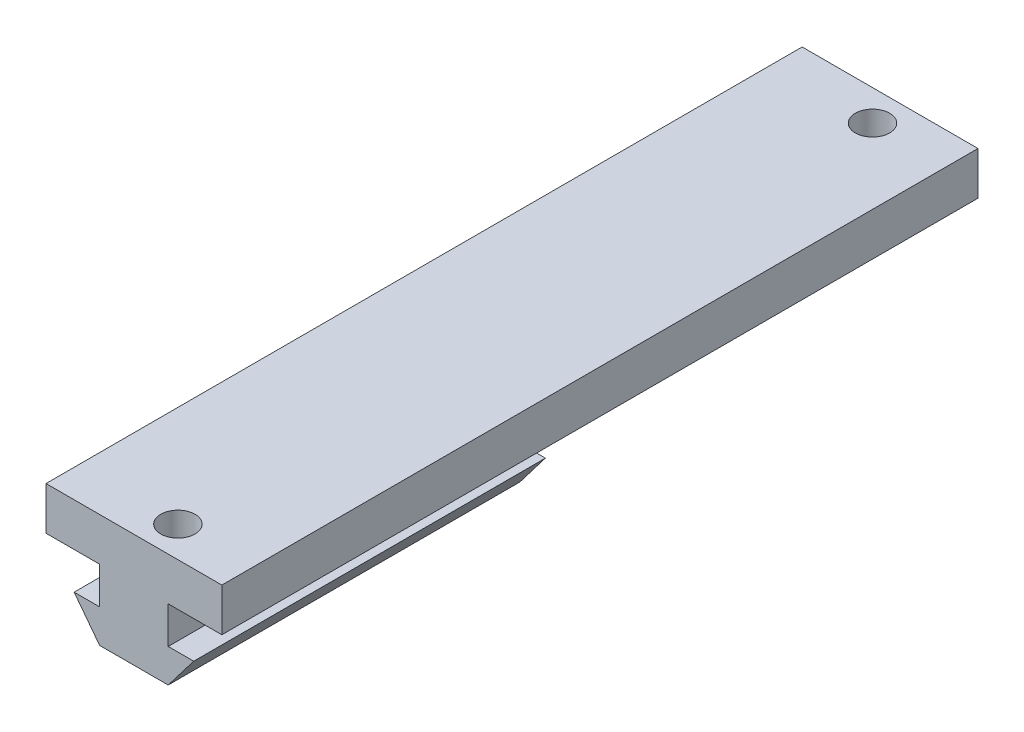
ISO-10303-21;
HEADER;
FILE_DESCRIPTION(('STEP AP214'),'2;1');
FILE_NAME('part.step','',(''),(''),'','','');
FILE_SCHEMA(('AUTOMOTIVE_DESIGN { 1 0 10303 214 1 1 1 1 }'));
ENDSEC;
DATA;
#1=APPLICATION_CONTEXT('core data for automotive mechanical design processes');
#2=APPLICATION_PROTOCOL_DEFINITION('international standard','automotive_design',2000,#1);
#3=PRODUCT_CONTEXT('',#1,'mechanical');
#4=PRODUCT('Part','Part','',(#3));
#5=PRODUCT_RELATED_PRODUCT_CATEGORY('part','',(#4));
#6=PRODUCT_DEFINITION_FORMATION('','',#4);
#7=PRODUCT_DEFINITION_CONTEXT('part definition',#1,'design');
#8=PRODUCT_DEFINITION('design','',#6,#7);
#9=PRODUCT_DEFINITION_SHAPE('','',#8);
#10=(LENGTH_UNIT() NAMED_UNIT(*) SI_UNIT(.MILLI.,.METRE.));
#11=(NAMED_UNIT(*) PLANE_ANGLE_UNIT() SI_UNIT($,.RADIAN.));
#12=(NAMED_UNIT(*) SI_UNIT($,.STERADIAN.) SOLID_ANGLE_UNIT());
#13=UNCERTAINTY_MEASURE_WITH_UNIT(LENGTH_MEASURE(1.E-05),#10,'distance_accuracy_value','');
#14=(GEOMETRIC_REPRESENTATION_CONTEXT(3) GLOBAL_UNCERTAINTY_ASSIGNED_CONTEXT((#13)) GLOBAL_UNIT_ASSIGNED_CONTEXT((#10,
#11,#12)) REPRESENTATION_CONTEXT('',''));
#15=CARTESIAN_POINT('',(0.,0.,0.));
#16=DIRECTION('',(0.,0.,1.));
#17=DIRECTION('',(1.,0.,0.));
#18=AXIS2_PLACEMENT_3D('',#15,#16,#17);
#19=CARTESIAN_POINT('',(10.,4.9,43.));
#20=DIRECTION('',(-1.,0.,0.));
#21=DIRECTION('',(0.,0.,1.));
#22=AXIS2_PLACEMENT_3D('',#19,#20,#21);
#23=PLANE('',#22);
#24=DIRECTION('',(0.,0.,-1.));
#25=VECTOR('',#24,1.);
#26=CARTESIAN_POINT('',(10.,0.,43.));
#27=LINE('',#26,#25);
#28=CARTESIAN_POINT('',(10.,0.,43.));
#29=VERTEX_POINT('',#28);
#30=CARTESIAN_POINT('',(10.,0.,-43.));
#31=VERTEX_POINT('',#30);
#32=EDGE_CURVE('E221',#29,#31,#27,.T.);
#33=ORIENTED_EDGE('',*,*,#32,.T.);
#34=DIRECTION('',(0.,-1.,0.));
#35=VECTOR('',#34,1.);
#36=CARTESIAN_POINT('',(10.,4.9,-43.));
#37=LINE('',#36,#35);
#38=CARTESIAN_POINT('',(10.,4.9,-43.));
#39=VERTEX_POINT('',#38);
#40=EDGE_CURVE('E11',#39,#31,#37,.T.);
#41=ORIENTED_EDGE('',*,*,#40,.F.);
#42=DIRECTION('',(0.,0.,-1.));
#43=VECTOR('',#42,1.);
#44=CARTESIAN_POINT('',(10.,4.9,43.));
#45=LINE('',#44,#43);
#46=CARTESIAN_POINT('',(10.,4.9,43.));
#47=VERTEX_POINT('',#46);
#48=EDGE_CURVE('E239',#47,#39,#45,.T.);
#49=ORIENTED_EDGE('',*,*,#48,.F.);
#50=DIRECTION('',(0.,-1.,0.));
#51=VECTOR('',#50,1.);
#52=CARTESIAN_POINT('',(10.,4.9,43.));
#53=LINE('',#52,#51);
#54=EDGE_CURVE('E250',#47,#29,#53,.T.);
#55=ORIENTED_EDGE('',*,*,#54,.T.);
#56=EDGE_LOOP('',(#33,#41,#49,#55));
#57=FACE_BOUND('',#56,.T.);
#58=ADVANCED_FACE('F45',(#57),#23,.F.);
#59=CARTESIAN_POINT('',(-10.,4.9,-43.));
#60=DIRECTION('',(0.,0.,1.));
#61=DIRECTION('',(1.,0.,0.));
#62=AXIS2_PLACEMENT_3D('',#59,#60,#61);
#63=PLANE('',#62);
#64=DIRECTION('',(-1.,0.,0.));
#65=VECTOR('',#64,1.);
#66=CARTESIAN_POINT('',(-10.,0.,-43.));
#67=LINE('',#66,#65);
#68=CARTESIAN_POINT('',(-10.,0.,-43.));
#69=VERTEX_POINT('',#68);
#70=EDGE_CURVE('E254',#31,#69,#67,.T.);
#71=ORIENTED_EDGE('',*,*,#70,.T.);
#72=DIRECTION('',(0.,-1.,0.));
#73=VECTOR('',#72,1.);
#74=CARTESIAN_POINT('',(-10.,4.9,-43.));
#75=LINE('',#74,#73);
#76=CARTESIAN_POINT('',(-10.,4.9,-43.));
#77=VERTEX_POINT('',#76);
#78=EDGE_CURVE('E54',#77,#69,#75,.T.);
#79=ORIENTED_EDGE('',*,*,#78,.F.);
#80=DIRECTION('',(-1.,0.,0.));
#81=VECTOR('',#80,1.);
#82=CARTESIAN_POINT('',(-10.,4.9,-43.));
#83=LINE('',#82,#81);
#84=EDGE_CURVE('E98',#39,#77,#83,.T.);
#85=ORIENTED_EDGE('',*,*,#84,.F.);
#86=ORIENTED_EDGE('',*,*,#40,.T.);
#87=EDGE_LOOP('',(#71,#79,#85,#86));
#88=FACE_BOUND('',#87,.T.);
#89=ADVANCED_FACE('F296',(#88),#63,.F.);
#90=CARTESIAN_POINT('',(-10.,4.9,43.));
#91=DIRECTION('',(1.,0.,0.));
#92=DIRECTION('',(0.,0.,-1.));
#93=AXIS2_PLACEMENT_3D('',#90,#91,#92);
#94=PLANE('',#93);
#95=DIRECTION('',(0.,0.,1.));
#96=VECTOR('',#95,1.);
#97=CARTESIAN_POINT('',(-10.,0.,43.));
#98=LINE('',#97,#96);
#99=CARTESIAN_POINT('',(-10.,0.,43.));
#100=VERTEX_POINT('',#99);
#101=EDGE_CURVE('E257',#69,#100,#98,.T.);
#102=ORIENTED_EDGE('',*,*,#101,.T.);
#103=DIRECTION('',(0.,-1.,0.));
#104=VECTOR('',#103,1.);
#105=CARTESIAN_POINT('',(-10.,4.9,43.));
#106=LINE('',#105,#104);
#107=CARTESIAN_POINT('',(-10.,4.9,43.));
#108=VERTEX_POINT('',#107);
#109=EDGE_CURVE('E264',#108,#100,#106,.T.);
#110=ORIENTED_EDGE('',*,*,#109,.F.);
#111=DIRECTION('',(0.,0.,1.));
#112=VECTOR('',#111,1.);
#113=CARTESIAN_POINT('',(-10.,4.9,43.));
#114=LINE('',#113,#112);
#115=EDGE_CURVE('E245',#77,#108,#114,.T.);
#116=ORIENTED_EDGE('',*,*,#115,.F.);
#117=ORIENTED_EDGE('',*,*,#78,.T.);
#118=EDGE_LOOP('',(#102,#110,#116,#117));
#119=FACE_BOUND('',#118,.T.);
#120=ADVANCED_FACE('F273',(#119),#94,.F.);
#121=CARTESIAN_POINT('',(-10.,4.9,43.));
#122=DIRECTION('',(0.,0.,-1.));
#123=DIRECTION('',(-1.,0.,0.));
#124=AXIS2_PLACEMENT_3D('',#121,#122,#123);
#125=PLANE('',#124);
#126=DIRECTION('',(1.,0.,0.));
#127=VECTOR('',#126,1.);
#128=CARTESIAN_POINT('',(-10.,0.,43.));
#129=LINE('',#128,#127);
#130=CARTESIAN_POINT('',(-3.90000000000001,0.,43.));
#131=VERTEX_POINT('',#130);
#132=EDGE_CURVE('E242',#100,#131,#129,.T.);
#133=ORIENTED_EDGE('',*,*,#132,.T.);
#134=DIRECTION('',(0.,-1.,0.));
#135=VECTOR('',#134,1.);
#136=CARTESIAN_POINT('',(-3.90000000000001,0.,43.));
#137=LINE('',#136,#135);
#138=CARTESIAN_POINT('',(-3.90000000000001,-4.2,43.));
#139=VERTEX_POINT('',#138);
#140=EDGE_CURVE('E61',#131,#139,#137,.T.);
#141=ORIENTED_EDGE('',*,*,#140,.T.);
#142=DIRECTION('',(-1.,0.,0.));
#143=VECTOR('',#142,1.);
#144=CARTESIAN_POINT('',(-3.90000000000001,-4.2,43.));
#145=LINE('',#144,#143);
#146=CARTESIAN_POINT('',(-6.80000000000001,-4.2,43.));
#147=VERTEX_POINT('',#146);
#148=EDGE_CURVE('E200',#139,#147,#145,.T.);
#149=ORIENTED_EDGE('',*,*,#148,.T.);
#150=DIRECTION('',(0.606673319350191,-0.794951246045077,0.));
#151=VECTOR('',#150,1.);
#152=CARTESIAN_POINT('',(-6.80000000000001,-4.2,43.));
#153=LINE('',#152,#151);
#154=CARTESIAN_POINT('',(-3.90000000000001,-8.,43.));
#155=VERTEX_POINT('',#154);
#156=EDGE_CURVE('E204',#147,#155,#153,.T.);
#157=ORIENTED_EDGE('',*,*,#156,.T.);
#158=DIRECTION('',(1.,0.,0.));
#159=VECTOR('',#158,1.);
#160=CARTESIAN_POINT('',(-3.90000000000001,-8.,43.));
#161=LINE('',#160,#159);
#162=CARTESIAN_POINT('',(3.89999999999999,-8.,43.));
#163=VERTEX_POINT('',#162);
#164=EDGE_CURVE('E208',#155,#163,#161,.T.);
#165=ORIENTED_EDGE('',*,*,#164,.T.);
#166=DIRECTION('',(0.606673319350191,0.794951246045077,0.));
#167=VECTOR('',#166,1.);
#168=CARTESIAN_POINT('',(3.89999999999999,-8.,43.));
#169=LINE('',#168,#167);
#170=CARTESIAN_POINT('',(6.79999999999999,-4.2,43.));
#171=VERTEX_POINT('',#170);
#172=EDGE_CURVE('E212',#163,#171,#169,.T.);
#173=ORIENTED_EDGE('',*,*,#172,.T.);
#174=DIRECTION('',(-1.,0.,0.));
#175=VECTOR('',#174,1.);
#176=CARTESIAN_POINT('',(6.79999999999999,-4.2,43.));
#177=LINE('',#176,#175);
#178=CARTESIAN_POINT('',(3.89999999999999,-4.2,43.));
#179=VERTEX_POINT('',#178);
#180=EDGE_CURVE('E172',#171,#179,#177,.T.);
#181=ORIENTED_EDGE('',*,*,#180,.T.);
#182=DIRECTION('',(0.,1.,0.));
#183=VECTOR('',#182,1.);
#184=CARTESIAN_POINT('',(3.89999999999999,-4.2,43.));
#185=LINE('',#184,#183);
#186=CARTESIAN_POINT('',(3.89999999999998,0.,43.));
#187=VERTEX_POINT('',#186);
#188=EDGE_CURVE('E169',#179,#187,#185,.T.);
#189=ORIENTED_EDGE('',*,*,#188,.T.);
#190=EDGE_CURVE('E91',#187,#29,#129,.T.);
#191=ORIENTED_EDGE('',*,*,#190,.T.);
#192=ORIENTED_EDGE('',*,*,#54,.F.);
#193=DIRECTION('',(1.,0.,0.));
#194=VECTOR('',#193,1.);
#195=CARTESIAN_POINT('',(-10.,4.9,43.));
#196=LINE('',#195,#194);
#197=EDGE_CURVE('E70',#108,#47,#196,.T.);
#198=ORIENTED_EDGE('',*,*,#197,.F.);
#199=ORIENTED_EDGE('',*,*,#109,.T.);
#200=EDGE_LOOP('',(#133,#141,#149,#157,#165,#173,#181,#189,#191,#192,#198,#199));
#201=FACE_BOUND('',#200,.T.);
#202=ADVANCED_FACE('F276',(#201),#125,.F.);
#203=CARTESIAN_POINT('',(0.,4.9,0.));
#204=DIRECTION('',(0.,-1.,0.));
#205=DIRECTION('',(0.,0.,-1.));
#206=AXIS2_PLACEMENT_3D('',#203,#204,#205);
#207=PLANE('',#206);
#208=CARTESIAN_POINT('',(1.49999999999999,4.9,39.5));
#209=DIRECTION('',(0.,1.,0.));
#210=DIRECTION('',(0.,0.,1.));
#211=AXIS2_PLACEMENT_3D('',#208,#209,#210);
#212=CIRCLE('',#211,1.95);
#213=CARTESIAN_POINT('',(1.49999999999999,4.9,41.45));
#214=VERTEX_POINT('',#213);
#215=EDGE_CURVE('E480',#214,#214,#212,.T.);
#216=ORIENTED_EDGE('',*,*,#215,.F.);
#217=EDGE_LOOP('',(#216));
#218=FACE_BOUND('',#217,.T.);
#219=CARTESIAN_POINT('',(1.49999999999998,4.9,-39.5));
#220=DIRECTION('',(0.,1.,0.));
#221=DIRECTION('',(0.,0.,1.));
#222=AXIS2_PLACEMENT_3D('',#219,#220,#221);
#223=CIRCLE('',#222,1.95);
#224=CARTESIAN_POINT('',(1.49999999999998,4.9,-37.55));
#225=VERTEX_POINT('',#224);
#226=EDGE_CURVE('E175',#225,#225,#223,.T.);
#227=ORIENTED_EDGE('',*,*,#226,.F.);
#228=EDGE_LOOP('',(#227));
#229=FACE_BOUND('',#228,.T.);
#230=ORIENTED_EDGE('',*,*,#48,.T.);
#231=ORIENTED_EDGE('',*,*,#84,.T.);
#232=ORIENTED_EDGE('',*,*,#115,.T.);
#233=ORIENTED_EDGE('',*,*,#197,.T.);
#234=EDGE_LOOP('',(#230,#231,#232,#233));
#235=FACE_BOUND('',#234,.T.);
#236=ADVANCED_FACE('F280',(#218,#229,#235),#207,.F.);
#237=CARTESIAN_POINT('',(0.,0.,0.));
#238=DIRECTION('',(0.,-1.,0.));
#239=DIRECTION('',(0.,0.,-1.));
#240=AXIS2_PLACEMENT_3D('',#237,#238,#239);
#241=PLANE('',#240);
#242=CARTESIAN_POINT('',(1.49999999999998,0.,-39.5));
#243=DIRECTION('',(0.,-1.,0.));
#244=DIRECTION('',(0.,0.,-1.));
#245=AXIS2_PLACEMENT_3D('',#242,#243,#244);
#246=CIRCLE('',#245,1.95);
#247=CARTESIAN_POINT('',(1.49999999999998,0.,-41.45));
#248=VERTEX_POINT('',#247);
#249=EDGE_CURVE('E48',#248,#248,#246,.T.);
#250=ORIENTED_EDGE('',*,*,#249,.F.);
#251=EDGE_LOOP('',(#250));
#252=FACE_BOUND('',#251,.T.);
#253=DIRECTION('',(0.,0.,1.));
#254=VECTOR('',#253,1.);
#255=CARTESIAN_POINT('',(3.89999999999998,0.,2.99999999999999));
#256=LINE('',#255,#254);
#257=CARTESIAN_POINT('',(3.89999999999998,0.,2.99999999999999));
#258=VERTEX_POINT('',#257);
#259=EDGE_CURVE('E167',#258,#187,#256,.T.);
#260=ORIENTED_EDGE('',*,*,#259,.F.);
#261=DIRECTION('',(-1.,0.,0.));
#262=VECTOR('',#261,1.);
#263=CARTESIAN_POINT('',(-3.90000000000001,0.,2.99999999999999));
#264=LINE('',#263,#262);
#265=CARTESIAN_POINT('',(-3.90000000000001,0.,2.99999999999999));
#266=VERTEX_POINT('',#265);
#267=EDGE_CURVE('E158',#258,#266,#264,.T.);
#268=ORIENTED_EDGE('',*,*,#267,.T.);
#269=DIRECTION('',(0.,0.,1.));
#270=VECTOR('',#269,1.);
#271=CARTESIAN_POINT('',(-3.90000000000001,0.,2.99999999999999));
#272=LINE('',#271,#270);
#273=EDGE_CURVE('E142',#266,#131,#272,.T.);
#274=ORIENTED_EDGE('',*,*,#273,.T.);
#275=ORIENTED_EDGE('',*,*,#132,.F.);
#276=ORIENTED_EDGE('',*,*,#101,.F.);
#277=ORIENTED_EDGE('',*,*,#70,.F.);
#278=ORIENTED_EDGE('',*,*,#32,.F.);
#279=ORIENTED_EDGE('',*,*,#190,.F.);
#280=EDGE_LOOP('',(#260,#268,#274,#275,#276,#277,#278,#279));
#281=FACE_BOUND('',#280,.T.);
#282=ADVANCED_FACE('F166',(#252,#281),#241,.T.);
#283=CARTESIAN_POINT('',(3.89999999999999,-4.2,2.99999999999999));
#284=DIRECTION('',(1.,0.,0.));
#285=DIRECTION('',(0.,1.,0.));
#286=AXIS2_PLACEMENT_3D('',#283,#284,#285);
#287=PLANE('',#286);
#288=ORIENTED_EDGE('',*,*,#188,.F.);
#289=DIRECTION('',(0.,0.,1.));
#290=VECTOR('',#289,1.);
#291=CARTESIAN_POINT('',(3.89999999999999,-4.2,2.99999999999999));
#292=LINE('',#291,#290);
#293=CARTESIAN_POINT('',(3.89999999999999,-4.2,2.99999999999999));
#294=VERTEX_POINT('',#293);
#295=EDGE_CURVE('E222',#294,#179,#292,.T.);
#296=ORIENTED_EDGE('',*,*,#295,.F.);
#297=DIRECTION('',(0.,1.,0.));
#298=VECTOR('',#297,1.);
#299=CARTESIAN_POINT('',(3.89999999999999,-4.2,2.99999999999999));
#300=LINE('',#299,#298);
#301=EDGE_CURVE('E152',#294,#258,#300,.T.);
#302=ORIENTED_EDGE('',*,*,#301,.T.);
#303=ORIENTED_EDGE('',*,*,#259,.T.);
#304=EDGE_LOOP('',(#288,#296,#302,#303));
#305=FACE_BOUND('',#304,.T.);
#306=ADVANCED_FACE('F288',(#305),#287,.T.);
#307=CARTESIAN_POINT('',(6.79999999999999,-4.2,2.99999999999999));
#308=DIRECTION('',(0.,1.,0.));
#309=DIRECTION('',(0.,0.,1.));
#310=AXIS2_PLACEMENT_3D('',#307,#308,#309);
#311=PLANE('',#310);
#312=ORIENTED_EDGE('',*,*,#180,.F.);
#313=DIRECTION('',(0.,0.,1.));
#314=VECTOR('',#313,1.);
#315=CARTESIAN_POINT('',(6.79999999999999,-4.2,2.99999999999999));
#316=LINE('',#315,#314);
#317=CARTESIAN_POINT('',(6.79999999999999,-4.2,2.99999999999999));
#318=VERTEX_POINT('',#317);
#319=EDGE_CURVE('E225',#318,#171,#316,.T.);
#320=ORIENTED_EDGE('',*,*,#319,.F.);
#321=DIRECTION('',(-1.,0.,0.));
#322=VECTOR('',#321,1.);
#323=CARTESIAN_POINT('',(6.79999999999999,-4.2,2.99999999999999));
#324=LINE('',#323,#322);
#325=EDGE_CURVE('E192',#318,#294,#324,.T.);
#326=ORIENTED_EDGE('',*,*,#325,.T.);
#327=ORIENTED_EDGE('',*,*,#295,.T.);
#328=EDGE_LOOP('',(#312,#320,#326,#327));
#329=FACE_BOUND('',#328,.T.);
#330=ADVANCED_FACE('F322',(#329),#311,.T.);
#331=CARTESIAN_POINT('',(3.89999999999999,-8.,2.99999999999999));
#332=DIRECTION('',(0.794951246045077,-0.606673319350191,0.));
#333=DIRECTION('',(0.606673319350191,0.794951246045077,0.));
#334=AXIS2_PLACEMENT_3D('',#331,#332,#333);
#335=PLANE('',#334);
#336=ORIENTED_EDGE('',*,*,#172,.F.);
#337=DIRECTION('',(0.,0.,1.));
#338=VECTOR('',#337,1.);
#339=CARTESIAN_POINT('',(3.89999999999999,-8.,2.99999999999999));
#340=LINE('',#339,#338);
#341=CARTESIAN_POINT('',(3.89999999999999,-8.,2.99999999999999));
#342=VERTEX_POINT('',#341);
#343=EDGE_CURVE('E228',#342,#163,#340,.T.);
#344=ORIENTED_EDGE('',*,*,#343,.F.);
#345=DIRECTION('',(0.606673319350191,0.794951246045077,0.));
#346=VECTOR('',#345,1.);
#347=CARTESIAN_POINT('',(3.89999999999999,-8.,2.99999999999999));
#348=LINE('',#347,#346);
#349=EDGE_CURVE('E188',#342,#318,#348,.T.);
#350=ORIENTED_EDGE('',*,*,#349,.T.);
#351=ORIENTED_EDGE('',*,*,#319,.T.);
#352=EDGE_LOOP('',(#336,#344,#350,#351));
#353=FACE_BOUND('',#352,.T.);
#354=ADVANCED_FACE('F333',(#353),#335,.T.);
#355=CARTESIAN_POINT('',(-3.90000000000001,-8.,2.99999999999999));
#356=DIRECTION('',(0.,-1.,0.));
#357=DIRECTION('',(1.,0.,0.));
#358=AXIS2_PLACEMENT_3D('',#355,#356,#357);
#359=PLANE('',#358);
#360=ORIENTED_EDGE('',*,*,#164,.F.);
#361=DIRECTION('',(0.,0.,1.));
#362=VECTOR('',#361,1.);
#363=CARTESIAN_POINT('',(-3.90000000000001,-8.,2.99999999999999));
#364=LINE('',#363,#362);
#365=CARTESIAN_POINT('',(-3.90000000000001,-8.,2.99999999999999));
#366=VERTEX_POINT('',#365);
#367=EDGE_CURVE('E231',#366,#155,#364,.T.);
#368=ORIENTED_EDGE('',*,*,#367,.F.);
#369=DIRECTION('',(1.,0.,0.));
#370=VECTOR('',#369,1.);
#371=CARTESIAN_POINT('',(-3.90000000000001,-8.,2.99999999999999));
#372=LINE('',#371,#370);
#373=EDGE_CURVE('E184',#366,#342,#372,.T.);
#374=ORIENTED_EDGE('',*,*,#373,.T.);
#375=ORIENTED_EDGE('',*,*,#343,.T.);
#376=EDGE_LOOP('',(#360,#368,#374,#375));
#377=FACE_BOUND('',#376,.T.);
#378=ADVANCED_FACE('F344',(#377),#359,.T.);
#379=CARTESIAN_POINT('',(-6.80000000000001,-4.2,2.99999999999999));
#380=DIRECTION('',(-0.794951246045077,-0.606673319350191,0.));
#381=DIRECTION('',(0.606673319350191,-0.794951246045077,0.));
#382=AXIS2_PLACEMENT_3D('',#379,#380,#381);
#383=PLANE('',#382);
#384=ORIENTED_EDGE('',*,*,#156,.F.);
#385=DIRECTION('',(0.,0.,1.));
#386=VECTOR('',#385,1.);
#387=CARTESIAN_POINT('',(-6.80000000000001,-4.2,2.99999999999999));
#388=LINE('',#387,#386);
#389=CARTESIAN_POINT('',(-6.80000000000001,-4.2,2.99999999999999));
#390=VERTEX_POINT('',#389);
#391=EDGE_CURVE('E234',#390,#147,#388,.T.);
#392=ORIENTED_EDGE('',*,*,#391,.F.);
#393=DIRECTION('',(0.606673319350191,-0.794951246045077,0.));
#394=VECTOR('',#393,1.);
#395=CARTESIAN_POINT('',(-6.80000000000001,-4.2,2.99999999999999));
#396=LINE('',#395,#394);
#397=EDGE_CURVE('E180',#390,#366,#396,.T.);
#398=ORIENTED_EDGE('',*,*,#397,.T.);
#399=ORIENTED_EDGE('',*,*,#367,.T.);
#400=EDGE_LOOP('',(#384,#392,#398,#399));
#401=FACE_BOUND('',#400,.T.);
#402=ADVANCED_FACE('F355',(#401),#383,.T.);
#403=CARTESIAN_POINT('',(-3.90000000000001,-4.2,2.99999999999999));
#404=DIRECTION('',(0.,1.,0.));
#405=DIRECTION('',(-1.,0.,0.));
#406=AXIS2_PLACEMENT_3D('',#403,#404,#405);
#407=PLANE('',#406);
#408=ORIENTED_EDGE('',*,*,#148,.F.);
#409=DIRECTION('',(0.,0.,1.));
#410=VECTOR('',#409,1.);
#411=CARTESIAN_POINT('',(-3.90000000000001,-4.2,2.99999999999999));
#412=LINE('',#411,#410);
#413=CARTESIAN_POINT('',(-3.90000000000001,-4.2,2.99999999999999));
#414=VERTEX_POINT('',#413);
#415=EDGE_CURVE('E151',#414,#139,#412,.T.);
#416=ORIENTED_EDGE('',*,*,#415,.F.);
#417=DIRECTION('',(-1.,0.,0.));
#418=VECTOR('',#417,1.);
#419=CARTESIAN_POINT('',(-3.90000000000001,-4.2,2.99999999999999));
#420=LINE('',#419,#418);
#421=EDGE_CURVE('E162',#414,#390,#420,.T.);
#422=ORIENTED_EDGE('',*,*,#421,.T.);
#423=ORIENTED_EDGE('',*,*,#391,.T.);
#424=EDGE_LOOP('',(#408,#416,#422,#423));
#425=FACE_BOUND('',#424,.T.);
#426=ADVANCED_FACE('F366',(#425),#407,.T.);
#427=CARTESIAN_POINT('',(-3.90000000000001,0.,2.99999999999999));
#428=DIRECTION('',(-1.,0.,0.));
#429=DIRECTION('',(0.,-1.,0.));
#430=AXIS2_PLACEMENT_3D('',#427,#428,#429);
#431=PLANE('',#430);
#432=ORIENTED_EDGE('',*,*,#140,.F.);
#433=ORIENTED_EDGE('',*,*,#273,.F.);
#434=DIRECTION('',(0.,-1.,0.));
#435=VECTOR('',#434,1.);
#436=CARTESIAN_POINT('',(-3.90000000000001,0.,2.99999999999999));
#437=LINE('',#436,#435);
#438=EDGE_CURVE('E145',#266,#414,#437,.T.);
#439=ORIENTED_EDGE('',*,*,#438,.T.);
#440=ORIENTED_EDGE('',*,*,#415,.T.);
#441=EDGE_LOOP('',(#432,#433,#439,#440));
#442=FACE_BOUND('',#441,.T.);
#443=ADVANCED_FACE('F144',(#442),#431,.T.);
#444=CARTESIAN_POINT('',(0.,0.,2.99999999999999));
#445=DIRECTION('',(0.,0.,1.));
#446=DIRECTION('',(1.,0.,0.));
#447=AXIS2_PLACEMENT_3D('',#444,#445,#446);
#448=PLANE('',#447);
#449=ORIENTED_EDGE('',*,*,#267,.F.);
#450=ORIENTED_EDGE('',*,*,#301,.F.);
#451=ORIENTED_EDGE('',*,*,#325,.F.);
#452=ORIENTED_EDGE('',*,*,#349,.F.);
#453=ORIENTED_EDGE('',*,*,#373,.F.);
#454=ORIENTED_EDGE('',*,*,#397,.F.);
#455=ORIENTED_EDGE('',*,*,#421,.F.);
#456=ORIENTED_EDGE('',*,*,#438,.F.);
#457=EDGE_LOOP('',(#449,#450,#451,#452,#453,#454,#455,#456));
#458=FACE_BOUND('',#457,.T.);
#459=ADVANCED_FACE('F156',(#458),#448,.F.);
#460=CARTESIAN_POINT('',(1.49999999999998,-1.1,-39.5));
#461=DIRECTION('',(0.,1.,0.));
#462=DIRECTION('',(0.,0.,1.));
#463=AXIS2_PLACEMENT_3D('',#460,#461,#462);
#464=CYLINDRICAL_SURFACE('',#463,1.95);
#465=ORIENTED_EDGE('',*,*,#249,.T.);
#466=EDGE_LOOP('',(#465));
#467=FACE_BOUND('',#466,.T.);
#468=ORIENTED_EDGE('',*,*,#226,.T.);
#469=EDGE_LOOP('',(#468));
#470=FACE_BOUND('',#469,.T.);
#471=ADVANCED_FACE('F394',(#467,#470),#464,.F.);
#472=CARTESIAN_POINT('',(1.49999999999999,-1.1,39.5));
#473=DIRECTION('',(0.,1.,0.));
#474=DIRECTION('',(0.,0.,1.));
#475=AXIS2_PLACEMENT_3D('',#472,#473,#474);
#476=CYLINDRICAL_SURFACE('',#475,1.95);
#477=CARTESIAN_POINT('',(1.49999999999999,-1.1,39.5));
#478=DIRECTION('',(0.,1.,0.));
#479=DIRECTION('',(0.,0.,1.));
#480=AXIS2_PLACEMENT_3D('',#477,#478,#479);
#481=CIRCLE('',#480,1.95);
#482=CARTESIAN_POINT('',(1.49999999999999,-1.1,41.45));
#483=VERTEX_POINT('',#482);
#484=EDGE_CURVE('E478',#483,#483,#481,.T.);
#485=ORIENTED_EDGE('',*,*,#484,.F.);
#486=EDGE_LOOP('',(#485));
#487=FACE_BOUND('',#486,.T.);
#488=ORIENTED_EDGE('',*,*,#215,.T.);
#489=EDGE_LOOP('',(#488));
#490=FACE_BOUND('',#489,.T.);
#491=ADVANCED_FACE('F416',(#487,#490),#476,.F.);
#492=CARTESIAN_POINT('',(1.49999999999999,-1.1,39.5));
#493=DIRECTION('',(0.,1.,0.));
#494=DIRECTION('',(0.,0.,1.));
#495=AXIS2_PLACEMENT_3D('',#492,#493,#494);
#496=PLANE('',#495);
#497=ORIENTED_EDGE('',*,*,#484,.T.);
#498=EDGE_LOOP('',(#497));
#499=FACE_BOUND('',#498,.T.);
#500=ADVANCED_FACE('F427',(#499),#496,.T.);
#501=CLOSED_SHELL('',(#58,#89,#120,#202,#236,#282,#306,#330,#354,#378,#402,#426,#443,#459,#471,
#491,#500));
#502=MANIFOLD_SOLID_BREP('B2',#501);
#503=ADVANCED_BREP_SHAPE_REPRESENTATION('',(#18,#502),#14);
#504=SHAPE_DEFINITION_REPRESENTATION(#9,#503);
ENDSEC;
END-ISO-10303-21;
